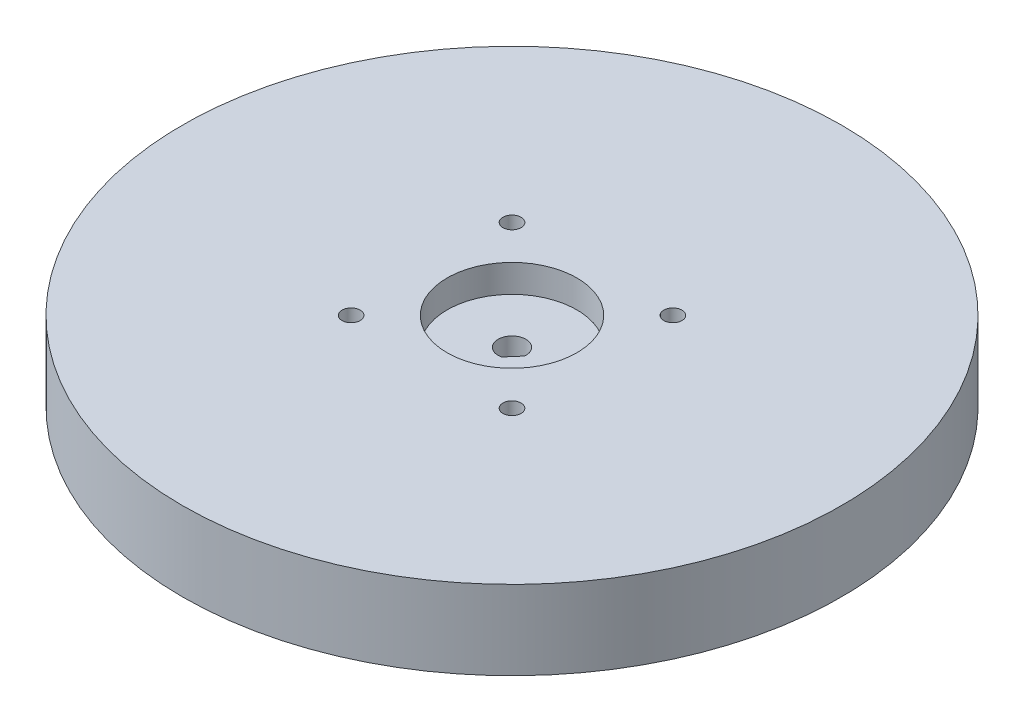
ISO-10303-21;
HEADER;
FILE_DESCRIPTION(('STEP AP214'),'2;1');
FILE_NAME('part.step','',(''),(''),'','','');
FILE_SCHEMA(('AUTOMOTIVE_DESIGN { 1 0 10303 214 1 1 1 1 }'));
ENDSEC;
DATA;
#1=APPLICATION_CONTEXT('core data for automotive mechanical design processes');
#2=APPLICATION_PROTOCOL_DEFINITION('international standard','automotive_design',2000,#1);
#3=PRODUCT_CONTEXT('',#1,'mechanical');
#4=PRODUCT('Part','Part','',(#3));
#5=PRODUCT_RELATED_PRODUCT_CATEGORY('part','',(#4));
#6=PRODUCT_DEFINITION_FORMATION('','',#4);
#7=PRODUCT_DEFINITION_CONTEXT('part definition',#1,'design');
#8=PRODUCT_DEFINITION('design','',#6,#7);
#9=PRODUCT_DEFINITION_SHAPE('','',#8);
#10=(LENGTH_UNIT() NAMED_UNIT(*) SI_UNIT(.MILLI.,.METRE.));
#11=(NAMED_UNIT(*) PLANE_ANGLE_UNIT() SI_UNIT($,.RADIAN.));
#12=(NAMED_UNIT(*) SI_UNIT($,.STERADIAN.) SOLID_ANGLE_UNIT());
#13=UNCERTAINTY_MEASURE_WITH_UNIT(LENGTH_MEASURE(1.E-05),#10,'distance_accuracy_value','');
#14=(GEOMETRIC_REPRESENTATION_CONTEXT(3) GLOBAL_UNCERTAINTY_ASSIGNED_CONTEXT((#13)) GLOBAL_UNIT_ASSIGNED_CONTEXT((#10,
#11,#12)) REPRESENTATION_CONTEXT('',''));
#15=CARTESIAN_POINT('',(0.,0.,0.));
#16=DIRECTION('',(0.,0.,1.));
#17=DIRECTION('',(1.,0.,0.));
#18=AXIS2_PLACEMENT_3D('',#15,#16,#17);
#19=CARTESIAN_POINT('',(1.64474842655029,0.,1.43369774825299));
#20=DIRECTION('',(0.75381483916227,0.,0.657086895515929));
#21=DIRECTION('',(0.657086895515929,0.,-0.75381483916227));
#22=AXIS2_PLACEMENT_3D('',#19,#20,#21);
#23=PLANE('',#22);
#24=DIRECTION('',(-0.657086895515929,0.,0.75381483916227));
#25=VECTOR('',#24,1.);
#26=CARTESIAN_POINT('',(1.64474842655029,9.906,1.43369774825299));
#27=LINE('',#26,#25);
#28=CARTESIAN_POINT('',(2.67079538205977,9.906,0.256609259624684));
#29=VERTEX_POINT('',#28);
#30=CARTESIAN_POINT('',(0.61870147104081,9.906,2.61078623688131));
#31=VERTEX_POINT('',#30);
#32=EDGE_CURVE('E55',#29,#31,#27,.T.);
#33=ORIENTED_EDGE('',*,*,#32,.F.);
#34=DIRECTION('',(0.,1.,0.));
#35=VECTOR('',#34,1.);
#36=CARTESIAN_POINT('',(2.67079538205977,0.,0.256609259624684));
#37=LINE('',#36,#35);
#38=CARTESIAN_POINT('',(2.67079538205977,0.,0.256609259624684));
#39=VERTEX_POINT('',#38);
#40=EDGE_CURVE('E71',#39,#29,#37,.T.);
#41=ORIENTED_EDGE('',*,*,#40,.F.);
#42=DIRECTION('',(0.657086895515929,0.,-0.753814839162269));
#43=VECTOR('',#42,1.);
#44=CARTESIAN_POINT('',(1.64474842655029,0.,1.43369774825299));
#45=LINE('',#44,#43);
#46=CARTESIAN_POINT('',(0.61870147104081,0.,2.61078623688131));
#47=VERTEX_POINT('',#46);
#48=EDGE_CURVE('E63',#47,#39,#45,.T.);
#49=ORIENTED_EDGE('',*,*,#48,.F.);
#50=DIRECTION('',(0.,1.,0.));
#51=VECTOR('',#50,1.);
#52=CARTESIAN_POINT('',(0.61870147104081,0.,2.61078623688131));
#53=LINE('',#52,#51);
#54=EDGE_CURVE('E73',#47,#31,#53,.T.);
#55=ORIENTED_EDGE('',*,*,#54,.T.);
#56=EDGE_LOOP('',(#33,#41,#49,#55));
#57=FACE_BOUND('',#56,.T.);
#58=ADVANCED_FACE('F42',(#57),#23,.F.);
#59=CARTESIAN_POINT('',(0.,0.,0.));
#60=DIRECTION('',(0.,1.,0.));
#61=DIRECTION('',(0.,0.,1.));
#62=AXIS2_PLACEMENT_3D('',#59,#60,#61);
#63=CYLINDRICAL_SURFACE('',#62,2.68309453522549);
#64=CARTESIAN_POINT('',(0.,9.906,0.));
#65=DIRECTION('',(0.,1.,0.));
#66=DIRECTION('',(0.,0.,1.));
#67=AXIS2_PLACEMENT_3D('',#64,#65,#66);
#68=CIRCLE('',#67,2.68309453522549);
#69=EDGE_CURVE('E11',#31,#29,#68,.F.);
#70=ORIENTED_EDGE('',*,*,#69,.F.);
#71=ORIENTED_EDGE('',*,*,#54,.F.);
#72=CARTESIAN_POINT('',(0.,0.,0.));
#73=DIRECTION('',(0.,1.,0.));
#74=DIRECTION('',(0.,0.,1.));
#75=AXIS2_PLACEMENT_3D('',#72,#73,#74);
#76=CIRCLE('',#75,2.68309453522549);
#77=EDGE_CURVE('E79',#39,#47,#76,.T.);
#78=ORIENTED_EDGE('',*,*,#77,.F.);
#79=ORIENTED_EDGE('',*,*,#40,.T.);
#80=EDGE_LOOP('',(#70,#71,#78,#79));
#81=FACE_BOUND('',#80,.T.);
#82=ADVANCED_FACE('F77',(#81),#63,.F.);
#83=CARTESIAN_POINT('',(0.,15.24,0.));
#84=DIRECTION('',(0.,-1.,0.));
#85=DIRECTION('',(0.,0.,-1.));
#86=AXIS2_PLACEMENT_3D('',#83,#84,#85);
#87=CYLINDRICAL_SURFACE('',#86,63.5);
#88=CARTESIAN_POINT('',(0.,15.24,0.));
#89=DIRECTION('',(0.,1.,0.));
#90=DIRECTION('',(0.,0.,1.));
#91=AXIS2_PLACEMENT_3D('',#88,#89,#90);
#92=CIRCLE('',#91,63.5);
#93=CARTESIAN_POINT('',(0.,15.24,-63.5));
#94=VERTEX_POINT('',#93);
#95=EDGE_CURVE('E50',#94,#94,#92,.T.);
#96=CARTESIAN_POINT('',(0.,0.,0.));
#97=DIRECTION('',(0.,1.,0.));
#98=DIRECTION('',(0.,0.,1.));
#99=AXIS2_PLACEMENT_3D('',#96,#97,#98);
#100=CIRCLE('',#99,63.5);
#101=CARTESIAN_POINT('',(0.,0.,-63.5));
#102=VERTEX_POINT('',#101);
#103=EDGE_CURVE('E81',#102,#102,#100,.T.);
#104=CARTESIAN_POINT('',(0.,15.24,-63.5));
#105=CARTESIAN_POINT('',(0.,15.08125,-63.5));
#106=CARTESIAN_POINT('',(0.,14.9225,-63.5));
#107=CARTESIAN_POINT('',(0.,14.605,-63.5));
#108=CARTESIAN_POINT('',(0.,14.44625,-63.5));
#109=CARTESIAN_POINT('',(0.,14.12875,-63.5));
#110=CARTESIAN_POINT('',(0.,13.97,-63.5));
#111=CARTESIAN_POINT('',(0.,13.6525,-63.5));
#112=CARTESIAN_POINT('',(0.,13.49375,-63.5));
#113=CARTESIAN_POINT('',(0.,13.17625,-63.5));
#114=CARTESIAN_POINT('',(0.,13.0175,-63.5));
#115=CARTESIAN_POINT('',(0.,12.7,-63.5));
#116=CARTESIAN_POINT('',(0.,12.54125,-63.5));
#117=CARTESIAN_POINT('',(0.,12.22375,-63.5));
#118=CARTESIAN_POINT('',(0.,12.065,-63.5));
#119=CARTESIAN_POINT('',(0.,11.7475,-63.5));
#120=CARTESIAN_POINT('',(0.,11.58875,-63.5));
#121=CARTESIAN_POINT('',(0.,11.27125,-63.5));
#122=CARTESIAN_POINT('',(0.,11.1125,-63.5));
#123=CARTESIAN_POINT('',(0.,10.795,-63.5));
#124=CARTESIAN_POINT('',(0.,10.63625,-63.5));
#125=CARTESIAN_POINT('',(0.,10.31875,-63.5));
#126=CARTESIAN_POINT('',(0.,10.16,-63.5));
#127=CARTESIAN_POINT('',(0.,9.8425,-63.5));
#128=CARTESIAN_POINT('',(0.,9.68375,-63.5));
#129=CARTESIAN_POINT('',(0.,9.36625,-63.5));
#130=CARTESIAN_POINT('',(0.,9.2075,-63.5));
#131=CARTESIAN_POINT('',(0.,8.89,-63.5));
#132=CARTESIAN_POINT('',(0.,8.73125,-63.5));
#133=CARTESIAN_POINT('',(0.,8.41375,-63.5));
#134=CARTESIAN_POINT('',(0.,8.255,-63.5));
#135=CARTESIAN_POINT('',(0.,7.9375,-63.5));
#136=CARTESIAN_POINT('',(0.,7.77875,-63.5));
#137=CARTESIAN_POINT('',(0.,7.46125,-63.5));
#138=CARTESIAN_POINT('',(0.,7.3025,-63.5));
#139=CARTESIAN_POINT('',(0.,6.985,-63.5));
#140=CARTESIAN_POINT('',(0.,6.82625,-63.5));
#141=CARTESIAN_POINT('',(0.,6.50875,-63.5));
#142=CARTESIAN_POINT('',(0.,6.35,-63.5));
#143=CARTESIAN_POINT('',(0.,6.0325,-63.5));
#144=CARTESIAN_POINT('',(0.,5.87375,-63.5));
#145=CARTESIAN_POINT('',(0.,5.55625,-63.5));
#146=CARTESIAN_POINT('',(0.,5.3975,-63.5));
#147=CARTESIAN_POINT('',(0.,5.08,-63.5));
#148=CARTESIAN_POINT('',(0.,4.92125,-63.5));
#149=CARTESIAN_POINT('',(0.,4.60375,-63.5));
#150=CARTESIAN_POINT('',(0.,4.445,-63.5));
#151=CARTESIAN_POINT('',(0.,4.1275,-63.5));
#152=CARTESIAN_POINT('',(0.,3.96875,-63.5));
#153=CARTESIAN_POINT('',(0.,3.65125,-63.5));
#154=CARTESIAN_POINT('',(0.,3.4925,-63.5));
#155=CARTESIAN_POINT('',(0.,3.175,-63.5));
#156=CARTESIAN_POINT('',(0.,3.01625,-63.5));
#157=CARTESIAN_POINT('',(0.,2.69875,-63.5));
#158=CARTESIAN_POINT('',(0.,2.54,-63.5));
#159=CARTESIAN_POINT('',(0.,2.2225,-63.5));
#160=CARTESIAN_POINT('',(0.,2.06375,-63.5));
#161=CARTESIAN_POINT('',(0.,1.74625,-63.5));
#162=CARTESIAN_POINT('',(0.,1.5875,-63.5));
#163=CARTESIAN_POINT('',(0.,1.27,-63.5));
#164=CARTESIAN_POINT('',(0.,1.11125,-63.5));
#165=CARTESIAN_POINT('',(0.,0.79375,-63.5));
#166=CARTESIAN_POINT('',(0.,0.634999999999999,-63.5));
#167=CARTESIAN_POINT('',(0.,0.3175,-63.5));
#168=CARTESIAN_POINT('',(0.,0.15875,-63.5));
#169=CARTESIAN_POINT('',(0.,0.,-63.5));
#170=B_SPLINE_CURVE_WITH_KNOTS('',3,(#104,#105,#106,#107,#108,#109,#110,#111,#112,#113,#114,
#115,#116,#117,#118,#119,#120,#121,#122,#123,#124,#125,#126,#127,#128,#129,#130,#131,#132,#133,
#134,#135,#136,#137,#138,#139,#140,#141,#142,#143,#144,#145,#146,#147,#148,#149,#150,#151,#152,
#153,#154,#155,#156,#157,#158,#159,#160,#161,#162,#163,#164,#165,#166,#167,#168,#169),
.UNSPECIFIED.,.F.,.F.,(4,2,2,2,2,2,2,2,2,2,2,2,2,2,2,2,2,2,2,2,2,2,2,2,2,2,2,2,2,2,2,2,4),(0.,
0.476250000000001,0.9525,1.42875,1.905,2.38125,2.8575,3.33375,3.81,4.28625,4.7625,5.23875,5.715,
6.19125,6.6675,7.14375,7.62,8.09625,8.5725,9.04875,9.525,10.00125,10.4775,10.95375,11.43,
11.90625,12.3825,12.85875,13.335,13.81125,14.2875,14.76375,15.24),.UNSPECIFIED.);
#171=EDGE_CURVE('BSEAM44',#94,#102,#170,.T.);
#172=ORIENTED_EDGE('',*,*,#95,.F.);
#173=ORIENTED_EDGE('',*,*,#103,.T.);
#174=ORIENTED_EDGE('',*,*,#171,.T.);
#175=ORIENTED_EDGE('',*,*,#171,.F.);
#176=EDGE_LOOP('',(#172,#174,#173,#175));
#177=FACE_BOUND('',#176,.T.);
#178=ADVANCED_FACE('F44',(#177),#87,.T.);
#179=CARTESIAN_POINT('',(0.,15.24,0.));
#180=DIRECTION('',(0.,1.,0.));
#181=DIRECTION('',(0.,0.,1.));
#182=AXIS2_PLACEMENT_3D('',#179,#180,#181);
#183=PLANE('',#182);
#184=CARTESIAN_POINT('',(0.,15.24,0.));
#185=DIRECTION('',(0.,1.,0.));
#186=DIRECTION('',(0.,0.,1.));
#187=AXIS2_PLACEMENT_3D('',#184,#185,#186);
#188=CIRCLE('',#187,12.5);
#189=CARTESIAN_POINT('',(0.,15.24,12.5));
#190=VERTEX_POINT('',#189);
#191=EDGE_CURVE('E115',#190,#190,#188,.T.);
#192=ORIENTED_EDGE('',*,*,#191,.F.);
#193=EDGE_LOOP('',(#192));
#194=FACE_BOUND('',#193,.T.);
#195=CARTESIAN_POINT('',(-15.5,15.24,15.5));
#196=DIRECTION('',(0.,1.,0.));
#197=DIRECTION('',(0.,0.,1.));
#198=AXIS2_PLACEMENT_3D('',#195,#196,#197);
#199=CIRCLE('',#198,1.75);
#200=CARTESIAN_POINT('',(-15.5,15.24,17.25));
#201=VERTEX_POINT('',#200);
#202=EDGE_CURVE('E74',#201,#201,#199,.T.);
#203=ORIENTED_EDGE('',*,*,#202,.F.);
#204=EDGE_LOOP('',(#203));
#205=FACE_BOUND('',#204,.T.);
#206=CARTESIAN_POINT('',(15.5,15.24,15.5));
#207=DIRECTION('',(0.,1.,0.));
#208=DIRECTION('',(0.,0.,1.));
#209=AXIS2_PLACEMENT_3D('',#206,#207,#208);
#210=CIRCLE('',#209,1.75);
#211=CARTESIAN_POINT('',(15.5,15.24,17.25));
#212=VERTEX_POINT('',#211);
#213=EDGE_CURVE('E110',#212,#212,#210,.T.);
#214=ORIENTED_EDGE('',*,*,#213,.F.);
#215=EDGE_LOOP('',(#214));
#216=FACE_BOUND('',#215,.T.);
#217=CARTESIAN_POINT('',(15.5,15.24,-15.5));
#218=DIRECTION('',(0.,1.,0.));
#219=DIRECTION('',(0.,0.,1.));
#220=AXIS2_PLACEMENT_3D('',#217,#218,#219);
#221=CIRCLE('',#220,1.75);
#222=CARTESIAN_POINT('',(15.5,15.24,-13.75));
#223=VERTEX_POINT('',#222);
#224=EDGE_CURVE('E107',#223,#223,#221,.T.);
#225=ORIENTED_EDGE('',*,*,#224,.F.);
#226=EDGE_LOOP('',(#225));
#227=FACE_BOUND('',#226,.T.);
#228=CARTESIAN_POINT('',(-15.5,15.24,-15.5));
#229=DIRECTION('',(0.,1.,0.));
#230=DIRECTION('',(0.,0.,1.));
#231=AXIS2_PLACEMENT_3D('',#228,#229,#230);
#232=CIRCLE('',#231,1.75);
#233=CARTESIAN_POINT('',(-15.5,15.24,-13.75));
#234=VERTEX_POINT('',#233);
#235=EDGE_CURVE('E93',#234,#234,#232,.T.);
#236=ORIENTED_EDGE('',*,*,#235,.F.);
#237=EDGE_LOOP('',(#236));
#238=FACE_BOUND('',#237,.T.);
#239=ORIENTED_EDGE('',*,*,#95,.T.);
#240=EDGE_LOOP('',(#239));
#241=FACE_BOUND('',#240,.T.);
#242=ADVANCED_FACE('F128',(#194,#205,#216,#227,#238,#241),#183,.T.);
#243=CARTESIAN_POINT('',(0.,0.,0.));
#244=DIRECTION('',(0.,1.,0.));
#245=DIRECTION('',(0.,0.,1.));
#246=AXIS2_PLACEMENT_3D('',#243,#244,#245);
#247=PLANE('',#246);
#248=CARTESIAN_POINT('',(-15.5,0.,15.5));
#249=DIRECTION('',(0.,1.,0.));
#250=DIRECTION('',(0.,0.,1.));
#251=AXIS2_PLACEMENT_3D('',#248,#249,#250);
#252=CIRCLE('',#251,1.75);
#253=CARTESIAN_POINT('',(-15.5,0.,17.25));
#254=VERTEX_POINT('',#253);
#255=EDGE_CURVE('E98',#254,#254,#252,.T.);
#256=ORIENTED_EDGE('',*,*,#255,.T.);
#257=EDGE_LOOP('',(#256));
#258=FACE_BOUND('',#257,.T.);
#259=CARTESIAN_POINT('',(15.5,0.,15.5));
#260=DIRECTION('',(0.,1.,0.));
#261=DIRECTION('',(0.,0.,1.));
#262=AXIS2_PLACEMENT_3D('',#259,#260,#261);
#263=CIRCLE('',#262,1.75);
#264=CARTESIAN_POINT('',(15.5,0.,17.25));
#265=VERTEX_POINT('',#264);
#266=EDGE_CURVE('E96',#265,#265,#263,.T.);
#267=ORIENTED_EDGE('',*,*,#266,.T.);
#268=EDGE_LOOP('',(#267));
#269=FACE_BOUND('',#268,.T.);
#270=CARTESIAN_POINT('',(15.5,0.,-15.5));
#271=DIRECTION('',(0.,1.,0.));
#272=DIRECTION('',(0.,0.,1.));
#273=AXIS2_PLACEMENT_3D('',#270,#271,#272);
#274=CIRCLE('',#273,1.75);
#275=CARTESIAN_POINT('',(15.5,0.,-13.75));
#276=VERTEX_POINT('',#275);
#277=EDGE_CURVE('E92',#276,#276,#274,.T.);
#278=ORIENTED_EDGE('',*,*,#277,.T.);
#279=EDGE_LOOP('',(#278));
#280=FACE_BOUND('',#279,.T.);
#281=CARTESIAN_POINT('',(-15.5,0.,-15.5));
#282=DIRECTION('',(0.,1.,0.));
#283=DIRECTION('',(0.,0.,1.));
#284=AXIS2_PLACEMENT_3D('',#281,#282,#283);
#285=CIRCLE('',#284,1.75);
#286=CARTESIAN_POINT('',(-15.5,0.,-13.75));
#287=VERTEX_POINT('',#286);
#288=EDGE_CURVE('E89',#287,#287,#285,.T.);
#289=ORIENTED_EDGE('',*,*,#288,.T.);
#290=EDGE_LOOP('',(#289));
#291=FACE_BOUND('',#290,.T.);
#292=ORIENTED_EDGE('',*,*,#77,.T.);
#293=ORIENTED_EDGE('',*,*,#48,.T.);
#294=EDGE_LOOP('',(#292,#293));
#295=FACE_BOUND('',#294,.T.);
#296=ORIENTED_EDGE('',*,*,#103,.F.);
#297=EDGE_LOOP('',(#296));
#298=FACE_BOUND('',#297,.T.);
#299=ADVANCED_FACE('F131',(#258,#269,#280,#291,#295,#298),#247,.F.);
#300=CARTESIAN_POINT('',(-15.5,-40.386,-15.5));
#301=DIRECTION('',(0.,1.,0.));
#302=DIRECTION('',(0.,0.,1.));
#303=AXIS2_PLACEMENT_3D('',#300,#301,#302);
#304=CYLINDRICAL_SURFACE('',#303,1.75);
#305=ORIENTED_EDGE('',*,*,#235,.T.);
#306=EDGE_LOOP('',(#305));
#307=FACE_BOUND('',#306,.T.);
#308=ORIENTED_EDGE('',*,*,#288,.F.);
#309=EDGE_LOOP('',(#308));
#310=FACE_BOUND('',#309,.T.);
#311=ADVANCED_FACE('F148',(#307,#310),#304,.F.);
#312=CARTESIAN_POINT('',(15.5,-40.386,-15.5));
#313=DIRECTION('',(0.,1.,0.));
#314=DIRECTION('',(0.,0.,1.));
#315=AXIS2_PLACEMENT_3D('',#312,#313,#314);
#316=CYLINDRICAL_SURFACE('',#315,1.75);
#317=ORIENTED_EDGE('',*,*,#224,.T.);
#318=EDGE_LOOP('',(#317));
#319=FACE_BOUND('',#318,.T.);
#320=ORIENTED_EDGE('',*,*,#277,.F.);
#321=EDGE_LOOP('',(#320));
#322=FACE_BOUND('',#321,.T.);
#323=ADVANCED_FACE('F152',(#319,#322),#316,.F.);
#324=CARTESIAN_POINT('',(15.5,-40.386,15.5));
#325=DIRECTION('',(0.,1.,0.));
#326=DIRECTION('',(0.,0.,1.));
#327=AXIS2_PLACEMENT_3D('',#324,#325,#326);
#328=CYLINDRICAL_SURFACE('',#327,1.75);
#329=ORIENTED_EDGE('',*,*,#213,.T.);
#330=EDGE_LOOP('',(#329));
#331=FACE_BOUND('',#330,.T.);
#332=ORIENTED_EDGE('',*,*,#266,.F.);
#333=EDGE_LOOP('',(#332));
#334=FACE_BOUND('',#333,.T.);
#335=ADVANCED_FACE('F166',(#331,#334),#328,.F.);
#336=CARTESIAN_POINT('',(-15.5,-40.386,15.5));
#337=DIRECTION('',(0.,1.,0.));
#338=DIRECTION('',(0.,0.,1.));
#339=AXIS2_PLACEMENT_3D('',#336,#337,#338);
#340=CYLINDRICAL_SURFACE('',#339,1.75);
#341=ORIENTED_EDGE('',*,*,#202,.T.);
#342=EDGE_LOOP('',(#341));
#343=FACE_BOUND('',#342,.T.);
#344=ORIENTED_EDGE('',*,*,#255,.F.);
#345=EDGE_LOOP('',(#344));
#346=FACE_BOUND('',#345,.T.);
#347=ADVANCED_FACE('F164',(#343,#346),#340,.F.);
#348=CARTESIAN_POINT('',(0.,9.906,0.));
#349=DIRECTION('',(0.,1.,0.));
#350=DIRECTION('',(0.,0.,1.));
#351=AXIS2_PLACEMENT_3D('',#348,#349,#350);
#352=PLANE('',#351);
#353=CARTESIAN_POINT('',(0.,9.906,0.));
#354=DIRECTION('',(0.,1.,0.));
#355=DIRECTION('',(0.,0.,1.));
#356=AXIS2_PLACEMENT_3D('',#353,#354,#355);
#357=CIRCLE('',#356,12.5);
#358=CARTESIAN_POINT('',(0.,9.906,12.5));
#359=VERTEX_POINT('',#358);
#360=EDGE_CURVE('E75',#359,#359,#357,.T.);
#361=ORIENTED_EDGE('',*,*,#360,.T.);
#362=EDGE_LOOP('',(#361));
#363=FACE_BOUND('',#362,.T.);
#364=ORIENTED_EDGE('',*,*,#32,.T.);
#365=ORIENTED_EDGE('',*,*,#69,.T.);
#366=EDGE_LOOP('',(#364,#365));
#367=FACE_BOUND('',#366,.T.);
#368=ADVANCED_FACE('F68',(#363,#367),#352,.T.);
#369=CARTESIAN_POINT('',(0.,9.906,0.));
#370=DIRECTION('',(0.,1.,0.));
#371=DIRECTION('',(0.,0.,1.));
#372=AXIS2_PLACEMENT_3D('',#369,#370,#371);
#373=CYLINDRICAL_SURFACE('',#372,12.5);
#374=ORIENTED_EDGE('',*,*,#360,.F.);
#375=EDGE_LOOP('',(#374));
#376=FACE_BOUND('',#375,.T.);
#377=ORIENTED_EDGE('',*,*,#191,.T.);
#378=EDGE_LOOP('',(#377));
#379=FACE_BOUND('',#378,.T.);
#380=ADVANCED_FACE('F122',(#376,#379),#373,.F.);
#381=CLOSED_SHELL('',(#58,#82,#178,#242,#299,#311,#323,#335,#347,#368,#380));
#382=MANIFOLD_SOLID_BREP('B2',#381);
#383=ADVANCED_BREP_SHAPE_REPRESENTATION('',(#18,#382),#14);
#384=SHAPE_DEFINITION_REPRESENTATION(#9,#383);
ENDSEC;
END-ISO-10303-21;
